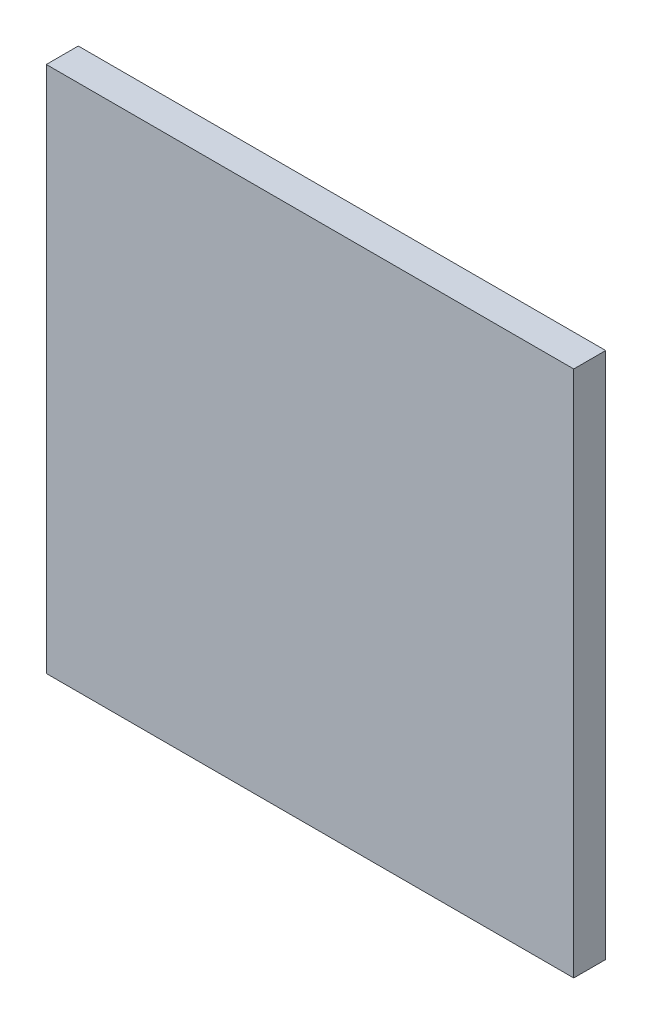
ISO-10303-21;
HEADER;
FILE_DESCRIPTION(('STEP AP214'),'2;1');
FILE_NAME('part.step','',(''),(''),'','','');
FILE_SCHEMA(('AUTOMOTIVE_DESIGN { 1 0 10303 214 1 1 1 1 }'));
ENDSEC;
DATA;
#1=APPLICATION_CONTEXT('core data for automotive mechanical design processes');
#2=APPLICATION_PROTOCOL_DEFINITION('international standard','automotive_design',2000,#1);
#3=PRODUCT_CONTEXT('',#1,'mechanical');
#4=PRODUCT('Part','Part','',(#3));
#5=PRODUCT_RELATED_PRODUCT_CATEGORY('part','',(#4));
#6=PRODUCT_DEFINITION_FORMATION('','',#4);
#7=PRODUCT_DEFINITION_CONTEXT('part definition',#1,'design');
#8=PRODUCT_DEFINITION('design','',#6,#7);
#9=PRODUCT_DEFINITION_SHAPE('','',#8);
#10=(LENGTH_UNIT() NAMED_UNIT(*) SI_UNIT(.MILLI.,.METRE.));
#11=(NAMED_UNIT(*) PLANE_ANGLE_UNIT() SI_UNIT($,.RADIAN.));
#12=(NAMED_UNIT(*) SI_UNIT($,.STERADIAN.) SOLID_ANGLE_UNIT());
#13=UNCERTAINTY_MEASURE_WITH_UNIT(LENGTH_MEASURE(1.E-05),#10,'distance_accuracy_value','');
#14=(GEOMETRIC_REPRESENTATION_CONTEXT(3) GLOBAL_UNCERTAINTY_ASSIGNED_CONTEXT((#13)) GLOBAL_UNIT_ASSIGNED_CONTEXT((#10,
#11,#12)) REPRESENTATION_CONTEXT('',''));
#15=CARTESIAN_POINT('',(0.,0.,0.));
#16=DIRECTION('',(0.,0.,1.));
#17=DIRECTION('',(1.,0.,0.));
#18=AXIS2_PLACEMENT_3D('',#15,#16,#17);
#19=CARTESIAN_POINT('',(-0.825,-0.825,0.1));
#20=DIRECTION('',(0.,0.,1.));
#21=DIRECTION('',(1.,0.,0.));
#22=AXIS2_PLACEMENT_3D('',#19,#20,#21);
#23=PLANE('',#22);
#24=DIRECTION('',(0.,1.,0.));
#25=VECTOR('',#24,1.);
#26=CARTESIAN_POINT('',(0.825,-0.825,0.1));
#27=LINE('',#26,#25);
#28=CARTESIAN_POINT('',(0.825,0.825,0.1));
#29=VERTEX_POINT('',#28);
#30=CARTESIAN_POINT('',(0.825,-0.825,0.1));
#31=VERTEX_POINT('',#30);
#32=EDGE_CURVE('E76',#29,#31,#27,.F.);
#33=ORIENTED_EDGE('',*,*,#32,.F.);
#34=DIRECTION('',(1.,0.,0.));
#35=VECTOR('',#34,1.);
#36=CARTESIAN_POINT('',(-0.825,0.825,0.1));
#37=LINE('',#36,#35);
#38=CARTESIAN_POINT('',(-0.825,0.825,0.1));
#39=VERTEX_POINT('',#38);
#40=EDGE_CURVE('E58',#39,#29,#37,.T.);
#41=ORIENTED_EDGE('',*,*,#40,.F.);
#42=DIRECTION('',(0.,1.,0.));
#43=VECTOR('',#42,1.);
#44=CARTESIAN_POINT('',(-0.825,-0.825,0.1));
#45=LINE('',#44,#43);
#46=CARTESIAN_POINT('',(-0.825,-0.825,0.1));
#47=VERTEX_POINT('',#46);
#48=EDGE_CURVE('E20',#39,#47,#45,.F.);
#49=ORIENTED_EDGE('',*,*,#48,.T.);
#50=DIRECTION('',(1.,0.,0.));
#51=VECTOR('',#50,1.);
#52=CARTESIAN_POINT('',(-0.825,-0.825,0.1));
#53=LINE('',#52,#51);
#54=EDGE_CURVE('E55',#47,#31,#53,.T.);
#55=ORIENTED_EDGE('',*,*,#54,.T.);
#56=EDGE_LOOP('',(#33,#41,#49,#55));
#57=FACE_BOUND('',#56,.T.);
#58=ADVANCED_FACE('F17',(#57),#23,.T.);
#59=CARTESIAN_POINT('',(-0.825,-0.825,0.));
#60=DIRECTION('',(1.,0.,0.));
#61=DIRECTION('',(0.,0.,-1.));
#62=AXIS2_PLACEMENT_3D('',#59,#60,#61);
#63=PLANE('',#62);
#64=DIRECTION('',(0.,0.,1.));
#65=VECTOR('',#64,1.);
#66=CARTESIAN_POINT('',(-0.825,0.825,0.));
#67=LINE('',#66,#65);
#68=CARTESIAN_POINT('',(-0.825,0.825,0.));
#69=VERTEX_POINT('',#68);
#70=EDGE_CURVE('E78',#69,#39,#67,.T.);
#71=ORIENTED_EDGE('',*,*,#70,.F.);
#72=DIRECTION('',(0.,1.,0.));
#73=VECTOR('',#72,1.);
#74=CARTESIAN_POINT('',(-0.825,-0.825,0.));
#75=LINE('',#74,#73);
#76=CARTESIAN_POINT('',(-0.825,-0.825,0.));
#77=VERTEX_POINT('',#76);
#78=EDGE_CURVE('E73',#69,#77,#75,.F.);
#79=ORIENTED_EDGE('',*,*,#78,.T.);
#80=DIRECTION('',(0.,0.,1.));
#81=VECTOR('',#80,1.);
#82=CARTESIAN_POINT('',(-0.825,-0.825,0.));
#83=LINE('',#82,#81);
#84=EDGE_CURVE('E63',#77,#47,#83,.T.);
#85=ORIENTED_EDGE('',*,*,#84,.T.);
#86=ORIENTED_EDGE('',*,*,#48,.F.);
#87=EDGE_LOOP('',(#71,#79,#85,#86));
#88=FACE_BOUND('',#87,.T.);
#89=ADVANCED_FACE('F72',(#88),#63,.F.);
#90=CARTESIAN_POINT('',(-0.825,-0.825,0.));
#91=DIRECTION('',(0.,1.,0.));
#92=DIRECTION('',(0.,0.,1.));
#93=AXIS2_PLACEMENT_3D('',#90,#91,#92);
#94=PLANE('',#93);
#95=ORIENTED_EDGE('',*,*,#54,.F.);
#96=ORIENTED_EDGE('',*,*,#84,.F.);
#97=DIRECTION('',(1.,0.,0.));
#98=VECTOR('',#97,1.);
#99=CARTESIAN_POINT('',(-0.825,-0.825,0.));
#100=LINE('',#99,#98);
#101=CARTESIAN_POINT('',(0.825,-0.825,0.));
#102=VERTEX_POINT('',#101);
#103=EDGE_CURVE('E83',#77,#102,#100,.T.);
#104=ORIENTED_EDGE('',*,*,#103,.T.);
#105=DIRECTION('',(0.,0.,-1.));
#106=VECTOR('',#105,1.);
#107=CARTESIAN_POINT('',(0.825,-0.825,0.));
#108=LINE('',#107,#106);
#109=EDGE_CURVE('E69',#31,#102,#108,.T.);
#110=ORIENTED_EDGE('',*,*,#109,.F.);
#111=EDGE_LOOP('',(#95,#96,#104,#110));
#112=FACE_BOUND('',#111,.T.);
#113=ADVANCED_FACE('F66',(#112),#94,.F.);
#114=CARTESIAN_POINT('',(0.825,-0.825,0.));
#115=DIRECTION('',(1.,0.,0.));
#116=DIRECTION('',(0.,0.,-1.));
#117=AXIS2_PLACEMENT_3D('',#114,#115,#116);
#118=PLANE('',#117);
#119=DIRECTION('',(0.,0.,1.));
#120=VECTOR('',#119,1.);
#121=CARTESIAN_POINT('',(0.825,0.825,0.));
#122=LINE('',#121,#120);
#123=CARTESIAN_POINT('',(0.825,0.825,0.));
#124=VERTEX_POINT('',#123);
#125=EDGE_CURVE('E34',#29,#124,#122,.F.);
#126=ORIENTED_EDGE('',*,*,#125,.F.);
#127=ORIENTED_EDGE('',*,*,#32,.T.);
#128=ORIENTED_EDGE('',*,*,#109,.T.);
#129=DIRECTION('',(0.,1.,0.));
#130=VECTOR('',#129,1.);
#131=CARTESIAN_POINT('',(0.825,-0.825,0.));
#132=LINE('',#131,#130);
#133=EDGE_CURVE('E26',#102,#124,#132,.T.);
#134=ORIENTED_EDGE('',*,*,#133,.T.);
#135=EDGE_LOOP('',(#126,#127,#128,#134));
#136=FACE_BOUND('',#135,.T.);
#137=ADVANCED_FACE('F88',(#136),#118,.T.);
#138=CARTESIAN_POINT('',(-0.825,0.825,0.));
#139=DIRECTION('',(0.,1.,0.));
#140=DIRECTION('',(0.,0.,1.));
#141=AXIS2_PLACEMENT_3D('',#138,#139,#140);
#142=PLANE('',#141);
#143=ORIENTED_EDGE('',*,*,#40,.T.);
#144=ORIENTED_EDGE('',*,*,#125,.T.);
#145=DIRECTION('',(1.,0.,0.));
#146=VECTOR('',#145,1.);
#147=CARTESIAN_POINT('',(-0.825,0.825,0.));
#148=LINE('',#147,#146);
#149=EDGE_CURVE('E11',#124,#69,#148,.F.);
#150=ORIENTED_EDGE('',*,*,#149,.T.);
#151=ORIENTED_EDGE('',*,*,#70,.T.);
#152=EDGE_LOOP('',(#143,#144,#150,#151));
#153=FACE_BOUND('',#152,.T.);
#154=ADVANCED_FACE('F91',(#153),#142,.T.);
#155=CARTESIAN_POINT('',(-0.825,-0.825,0.));
#156=DIRECTION('',(0.,0.,1.));
#157=DIRECTION('',(1.,0.,0.));
#158=AXIS2_PLACEMENT_3D('',#155,#156,#157);
#159=PLANE('',#158);
#160=ORIENTED_EDGE('',*,*,#133,.F.);
#161=ORIENTED_EDGE('',*,*,#103,.F.);
#162=ORIENTED_EDGE('',*,*,#78,.F.);
#163=ORIENTED_EDGE('',*,*,#149,.F.);
#164=EDGE_LOOP('',(#160,#161,#162,#163));
#165=FACE_BOUND('',#164,.T.);
#166=ADVANCED_FACE('F90',(#165),#159,.F.);
#167=CLOSED_SHELL('',(#58,#89,#113,#137,#154,#166));
#168=MANIFOLD_SOLID_BREP('B1',#167);
#169=ADVANCED_BREP_SHAPE_REPRESENTATION('',(#18,#168),#14);
#170=SHAPE_DEFINITION_REPRESENTATION(#9,#169);
ENDSEC;
END-ISO-10303-21;
